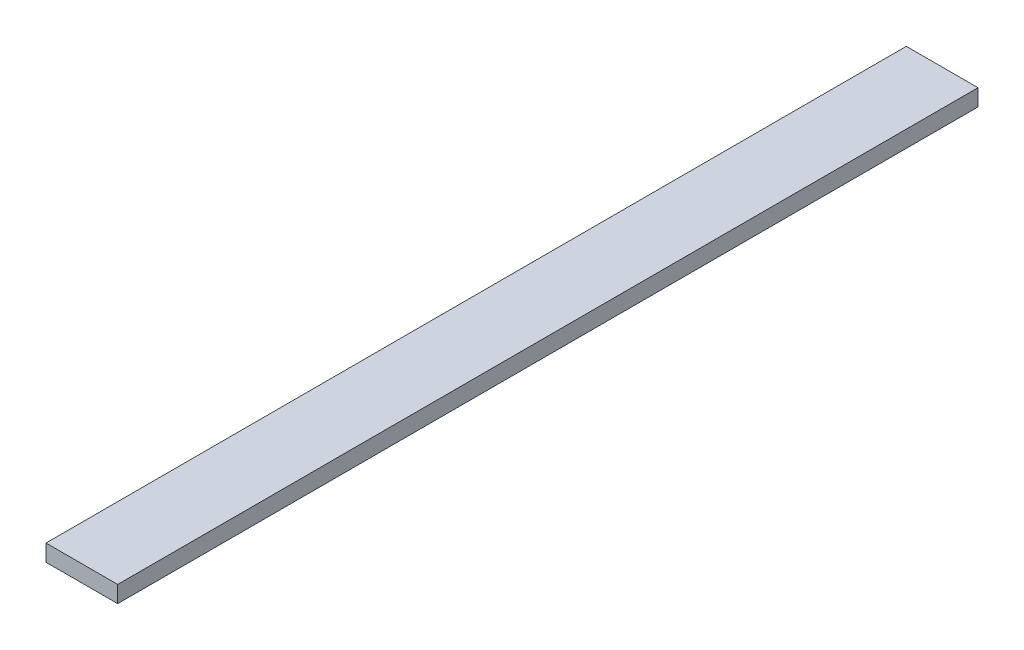
ISO-10303-21;
HEADER;
FILE_DESCRIPTION(('STEP AP214'),'2;1');
FILE_NAME('part.step','',(''),(''),'','','');
FILE_SCHEMA(('AUTOMOTIVE_DESIGN { 1 0 10303 214 1 1 1 1 }'));
ENDSEC;
DATA;
#1=APPLICATION_CONTEXT('core data for automotive mechanical design processes');
#2=APPLICATION_PROTOCOL_DEFINITION('international standard','automotive_design',2000,#1);
#3=PRODUCT_CONTEXT('',#1,'mechanical');
#4=PRODUCT('Part','Part','',(#3));
#5=PRODUCT_RELATED_PRODUCT_CATEGORY('part','',(#4));
#6=PRODUCT_DEFINITION_FORMATION('','',#4);
#7=PRODUCT_DEFINITION_CONTEXT('part definition',#1,'design');
#8=PRODUCT_DEFINITION('design','',#6,#7);
#9=PRODUCT_DEFINITION_SHAPE('','',#8);
#10=(LENGTH_UNIT() NAMED_UNIT(*) SI_UNIT(.MILLI.,.METRE.));
#11=(NAMED_UNIT(*) PLANE_ANGLE_UNIT() SI_UNIT($,.RADIAN.));
#12=(NAMED_UNIT(*) SI_UNIT($,.STERADIAN.) SOLID_ANGLE_UNIT());
#13=UNCERTAINTY_MEASURE_WITH_UNIT(LENGTH_MEASURE(1.E-05),#10,'distance_accuracy_value','');
#14=(GEOMETRIC_REPRESENTATION_CONTEXT(3) GLOBAL_UNCERTAINTY_ASSIGNED_CONTEXT((#13)) GLOBAL_UNIT_ASSIGNED_CONTEXT((#10,
#11,#12)) REPRESENTATION_CONTEXT('',''));
#15=CARTESIAN_POINT('',(0.,0.,0.));
#16=DIRECTION('',(0.,0.,1.));
#17=DIRECTION('',(1.,0.,0.));
#18=AXIS2_PLACEMENT_3D('',#15,#16,#17);
#19=CARTESIAN_POINT('',(25.4,11.81,-304.8));
#20=DIRECTION('',(-1.,0.,0.));
#21=DIRECTION('',(0.,0.,1.));
#22=AXIS2_PLACEMENT_3D('',#19,#20,#21);
#23=PLANE('',#22);
#24=DIRECTION('',(0.,0.,-1.));
#25=VECTOR('',#24,1.);
#26=CARTESIAN_POINT('',(25.4,0.,-304.8));
#27=LINE('',#26,#25);
#28=CARTESIAN_POINT('',(25.4,0.,304.8));
#29=VERTEX_POINT('',#28);
#30=CARTESIAN_POINT('',(25.4,0.,-304.8));
#31=VERTEX_POINT('',#30);
#32=EDGE_CURVE('E97',#29,#31,#27,.T.);
#33=ORIENTED_EDGE('',*,*,#32,.T.);
#34=DIRECTION('',(0.,-1.,0.));
#35=VECTOR('',#34,1.);
#36=CARTESIAN_POINT('',(25.4,11.81,-304.8));
#37=LINE('',#36,#35);
#38=CARTESIAN_POINT('',(25.4,11.81,-304.8));
#39=VERTEX_POINT('',#38);
#40=EDGE_CURVE('E11',#39,#31,#37,.T.);
#41=ORIENTED_EDGE('',*,*,#40,.F.);
#42=DIRECTION('',(0.,0.,-1.));
#43=VECTOR('',#42,1.);
#44=CARTESIAN_POINT('',(25.4,11.81,-304.8));
#45=LINE('',#44,#43);
#46=CARTESIAN_POINT('',(25.4,11.81,304.8));
#47=VERTEX_POINT('',#46);
#48=EDGE_CURVE('E85',#47,#39,#45,.T.);
#49=ORIENTED_EDGE('',*,*,#48,.F.);
#50=DIRECTION('',(0.,-1.,0.));
#51=VECTOR('',#50,1.);
#52=CARTESIAN_POINT('',(25.4,11.81,304.8));
#53=LINE('',#52,#51);
#54=EDGE_CURVE('E93',#47,#29,#53,.T.);
#55=ORIENTED_EDGE('',*,*,#54,.T.);
#56=EDGE_LOOP('',(#33,#41,#49,#55));
#57=FACE_BOUND('',#56,.T.);
#58=ADVANCED_FACE('F34',(#57),#23,.F.);
#59=CARTESIAN_POINT('',(-25.4,11.81,-304.8));
#60=DIRECTION('',(0.,0.,1.));
#61=DIRECTION('',(1.,0.,0.));
#62=AXIS2_PLACEMENT_3D('',#59,#60,#61);
#63=PLANE('',#62);
#64=DIRECTION('',(-1.,0.,0.));
#65=VECTOR('',#64,1.);
#66=CARTESIAN_POINT('',(-25.4,0.,-304.8));
#67=LINE('',#66,#65);
#68=CARTESIAN_POINT('',(-25.4,0.,-304.8));
#69=VERTEX_POINT('',#68);
#70=EDGE_CURVE('E89',#31,#69,#67,.T.);
#71=ORIENTED_EDGE('',*,*,#70,.T.);
#72=DIRECTION('',(0.,-1.,0.));
#73=VECTOR('',#72,1.);
#74=CARTESIAN_POINT('',(-25.4,11.81,-304.8));
#75=LINE('',#74,#73);
#76=CARTESIAN_POINT('',(-25.4,11.81,-304.8));
#77=VERTEX_POINT('',#76);
#78=EDGE_CURVE('E42',#77,#69,#75,.T.);
#79=ORIENTED_EDGE('',*,*,#78,.F.);
#80=DIRECTION('',(-1.,0.,0.));
#81=VECTOR('',#80,1.);
#82=CARTESIAN_POINT('',(-25.4,11.81,-304.8));
#83=LINE('',#82,#81);
#84=EDGE_CURVE('E80',#39,#77,#83,.T.);
#85=ORIENTED_EDGE('',*,*,#84,.F.);
#86=ORIENTED_EDGE('',*,*,#40,.T.);
#87=EDGE_LOOP('',(#71,#79,#85,#86));
#88=FACE_BOUND('',#87,.T.);
#89=ADVANCED_FACE('F88',(#88),#63,.F.);
#90=CARTESIAN_POINT('',(-25.4,11.81,-304.8));
#91=DIRECTION('',(1.,0.,0.));
#92=DIRECTION('',(0.,0.,-1.));
#93=AXIS2_PLACEMENT_3D('',#90,#91,#92);
#94=PLANE('',#93);
#95=DIRECTION('',(0.,0.,1.));
#96=VECTOR('',#95,1.);
#97=CARTESIAN_POINT('',(-25.4,0.,-304.8));
#98=LINE('',#97,#96);
#99=CARTESIAN_POINT('',(-25.4,0.,304.8));
#100=VERTEX_POINT('',#99);
#101=EDGE_CURVE('E67',#69,#100,#98,.T.);
#102=ORIENTED_EDGE('',*,*,#101,.T.);
#103=DIRECTION('',(0.,-1.,0.));
#104=VECTOR('',#103,1.);
#105=CARTESIAN_POINT('',(-25.4,11.81,304.8));
#106=LINE('',#105,#104);
#107=CARTESIAN_POINT('',(-25.4,11.81,304.8));
#108=VERTEX_POINT('',#107);
#109=EDGE_CURVE('E90',#108,#100,#106,.T.);
#110=ORIENTED_EDGE('',*,*,#109,.F.);
#111=DIRECTION('',(0.,0.,1.));
#112=VECTOR('',#111,1.);
#113=CARTESIAN_POINT('',(-25.4,11.81,-304.8));
#114=LINE('',#113,#112);
#115=EDGE_CURVE('E83',#77,#108,#114,.T.);
#116=ORIENTED_EDGE('',*,*,#115,.F.);
#117=ORIENTED_EDGE('',*,*,#78,.T.);
#118=EDGE_LOOP('',(#102,#110,#116,#117));
#119=FACE_BOUND('',#118,.T.);
#120=ADVANCED_FACE('F91',(#119),#94,.F.);
#121=CARTESIAN_POINT('',(-25.4,11.81,304.8));
#122=DIRECTION('',(0.,0.,-1.));
#123=DIRECTION('',(-1.,0.,0.));
#124=AXIS2_PLACEMENT_3D('',#121,#122,#123);
#125=PLANE('',#124);
#126=DIRECTION('',(1.,0.,0.));
#127=VECTOR('',#126,1.);
#128=CARTESIAN_POINT('',(-25.4,0.,304.8));
#129=LINE('',#128,#127);
#130=EDGE_CURVE('E73',#100,#29,#129,.T.);
#131=ORIENTED_EDGE('',*,*,#130,.T.);
#132=ORIENTED_EDGE('',*,*,#54,.F.);
#133=DIRECTION('',(1.,0.,0.));
#134=VECTOR('',#133,1.);
#135=CARTESIAN_POINT('',(-25.4,11.81,304.8));
#136=LINE('',#135,#134);
#137=EDGE_CURVE('E50',#108,#47,#136,.T.);
#138=ORIENTED_EDGE('',*,*,#137,.F.);
#139=ORIENTED_EDGE('',*,*,#109,.T.);
#140=EDGE_LOOP('',(#131,#132,#138,#139));
#141=FACE_BOUND('',#140,.T.);
#142=ADVANCED_FACE('F104',(#141),#125,.F.);
#143=CARTESIAN_POINT('',(0.,11.81,0.));
#144=DIRECTION('',(0.,1.,0.));
#145=DIRECTION('',(0.,0.,1.));
#146=AXIS2_PLACEMENT_3D('',#143,#144,#145);
#147=PLANE('',#146);
#148=ORIENTED_EDGE('',*,*,#48,.T.);
#149=ORIENTED_EDGE('',*,*,#84,.T.);
#150=ORIENTED_EDGE('',*,*,#115,.T.);
#151=ORIENTED_EDGE('',*,*,#137,.T.);
#152=EDGE_LOOP('',(#148,#149,#150,#151));
#153=FACE_BOUND('',#152,.T.);
#154=ADVANCED_FACE('F81',(#153),#147,.T.);
#155=CARTESIAN_POINT('',(0.,0.,0.));
#156=DIRECTION('',(0.,1.,0.));
#157=DIRECTION('',(0.,0.,1.));
#158=AXIS2_PLACEMENT_3D('',#155,#156,#157);
#159=PLANE('',#158);
#160=ORIENTED_EDGE('',*,*,#32,.F.);
#161=ORIENTED_EDGE('',*,*,#130,.F.);
#162=ORIENTED_EDGE('',*,*,#101,.F.);
#163=ORIENTED_EDGE('',*,*,#70,.F.);
#164=EDGE_LOOP('',(#160,#161,#162,#163));
#165=FACE_BOUND('',#164,.T.);
#166=ADVANCED_FACE('F107',(#165),#159,.F.);
#167=CLOSED_SHELL('',(#58,#89,#120,#142,#154,#166));
#168=MANIFOLD_SOLID_BREP('B2',#167);
#169=ADVANCED_BREP_SHAPE_REPRESENTATION('',(#18,#168),#14);
#170=SHAPE_DEFINITION_REPRESENTATION(#9,#169);
ENDSEC;
END-ISO-10303-21;
